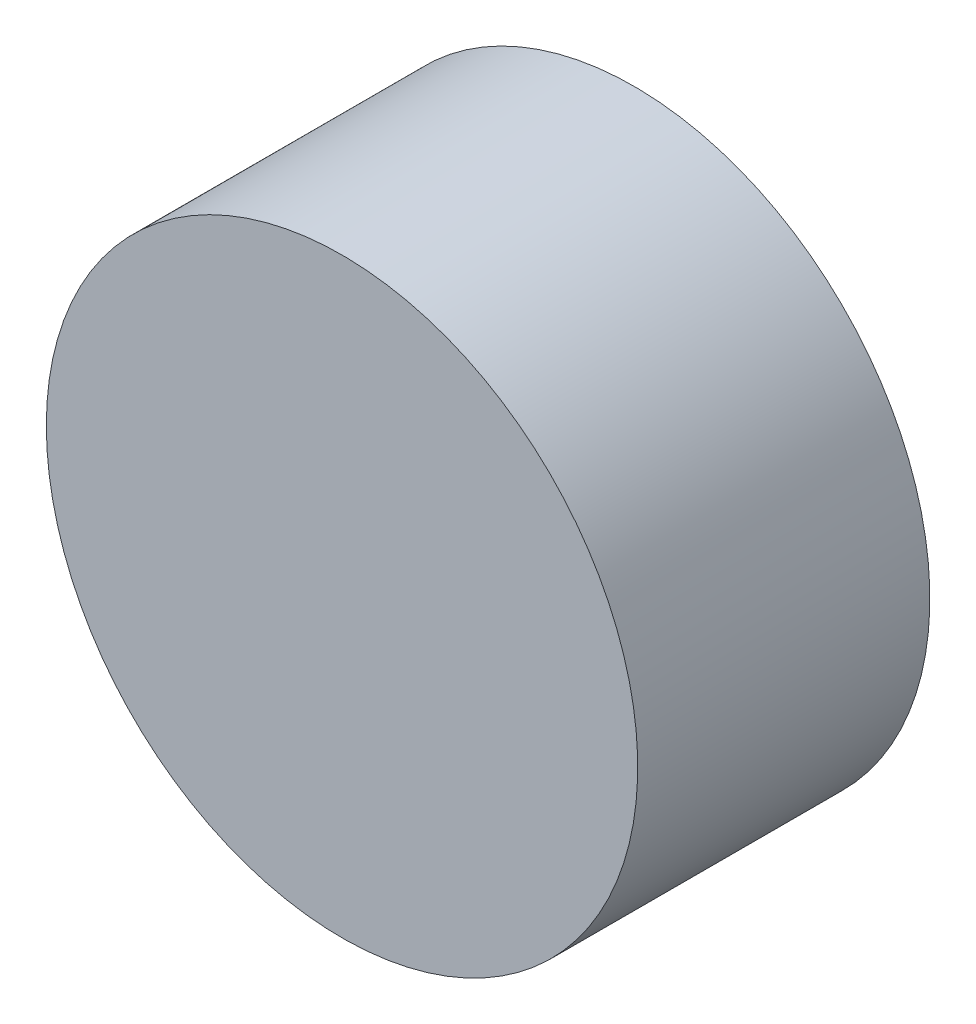
ISO-10303-21;
HEADER;
FILE_DESCRIPTION(('STEP AP214'),'2;1');
FILE_NAME('part.step','',(''),(''),'','','');
FILE_SCHEMA(('AUTOMOTIVE_DESIGN { 1 0 10303 214 1 1 1 1 }'));
ENDSEC;
DATA;
#1=APPLICATION_CONTEXT('core data for automotive mechanical design processes');
#2=APPLICATION_PROTOCOL_DEFINITION('international standard','automotive_design',2000,#1);
#3=PRODUCT_CONTEXT('',#1,'mechanical');
#4=PRODUCT('Part','Part','',(#3));
#5=PRODUCT_RELATED_PRODUCT_CATEGORY('part','',(#4));
#6=PRODUCT_DEFINITION_FORMATION('','',#4);
#7=PRODUCT_DEFINITION_CONTEXT('part definition',#1,'design');
#8=PRODUCT_DEFINITION('design','',#6,#7);
#9=PRODUCT_DEFINITION_SHAPE('','',#8);
#10=(LENGTH_UNIT() NAMED_UNIT(*) SI_UNIT(.MILLI.,.METRE.));
#11=(NAMED_UNIT(*) PLANE_ANGLE_UNIT() SI_UNIT($,.RADIAN.));
#12=(NAMED_UNIT(*) SI_UNIT($,.STERADIAN.) SOLID_ANGLE_UNIT());
#13=UNCERTAINTY_MEASURE_WITH_UNIT(LENGTH_MEASURE(1.E-05),#10,'distance_accuracy_value','');
#14=(GEOMETRIC_REPRESENTATION_CONTEXT(3) GLOBAL_UNCERTAINTY_ASSIGNED_CONTEXT((#13)) GLOBAL_UNIT_ASSIGNED_CONTEXT((#10,
#11,#12)) REPRESENTATION_CONTEXT('',''));
#15=CARTESIAN_POINT('',(0.,0.,0.));
#16=DIRECTION('',(0.,0.,1.));
#17=DIRECTION('',(1.,0.,0.));
#18=AXIS2_PLACEMENT_3D('',#15,#16,#17);
#19=CARTESIAN_POINT('',(0.,0.,10.));
#20=DIRECTION('',(0.,0.,1.));
#21=DIRECTION('',(1.,0.,0.));
#22=AXIS2_PLACEMENT_3D('',#19,#20,#21);
#23=PLANE('',#22);
#24=CARTESIAN_POINT('',(0.,0.,10.));
#25=DIRECTION('',(0.,0.,-1.));
#26=DIRECTION('',(-1.,0.,0.));
#27=AXIS2_PLACEMENT_3D('',#24,#25,#26);
#28=CIRCLE('',#27,10.1234567891235);
#29=CARTESIAN_POINT('',(-10.1234567891235,0.,10.));
#30=VERTEX_POINT('',#29);
#31=EDGE_CURVE('E17',#30,#30,#28,.T.);
#32=ORIENTED_EDGE('',*,*,#31,.F.);
#33=EDGE_LOOP('',(#32));
#34=FACE_BOUND('',#33,.T.);
#35=ADVANCED_FACE('F14',(#34),#23,.T.);
#36=CARTESIAN_POINT('',(0.,0.,0.));
#37=DIRECTION('',(0.,0.,1.));
#38=DIRECTION('',(1.,0.,0.));
#39=AXIS2_PLACEMENT_3D('',#36,#37,#38);
#40=PLANE('',#39);
#41=CARTESIAN_POINT('',(0.,0.,0.));
#42=DIRECTION('',(0.,0.,-1.));
#43=DIRECTION('',(-1.,0.,0.));
#44=AXIS2_PLACEMENT_3D('',#41,#42,#43);
#45=CIRCLE('',#44,10.1234567891235);
#46=CARTESIAN_POINT('',(-10.1234567891235,0.,0.));
#47=VERTEX_POINT('',#46);
#48=EDGE_CURVE('E9',#47,#47,#45,.F.);
#49=ORIENTED_EDGE('',*,*,#48,.F.);
#50=EDGE_LOOP('',(#49));
#51=FACE_BOUND('',#50,.T.);
#52=ADVANCED_FACE('F29',(#51),#40,.F.);
#53=CARTESIAN_POINT('',(0.,0.,10.));
#54=DIRECTION('',(0.,0.,-1.));
#55=DIRECTION('',(-1.,0.,0.));
#56=AXIS2_PLACEMENT_3D('',#53,#54,#55);
#57=CYLINDRICAL_SURFACE('',#56,10.1234567891235);
#58=ORIENTED_EDGE('',*,*,#48,.T.);
#59=EDGE_LOOP('',(#58));
#60=FACE_BOUND('',#59,.T.);
#61=ORIENTED_EDGE('',*,*,#31,.T.);
#62=EDGE_LOOP('',(#61));
#63=FACE_BOUND('',#62,.T.);
#64=ADVANCED_FACE('F26',(#60,#63),#57,.T.);
#65=CLOSED_SHELL('',(#35,#52,#64));
#66=MANIFOLD_SOLID_BREP('B1',#65);
#67=ADVANCED_BREP_SHAPE_REPRESENTATION('',(#18,#66),#14);
#68=SHAPE_DEFINITION_REPRESENTATION(#9,#67);
ENDSEC;
END-ISO-10303-21;
